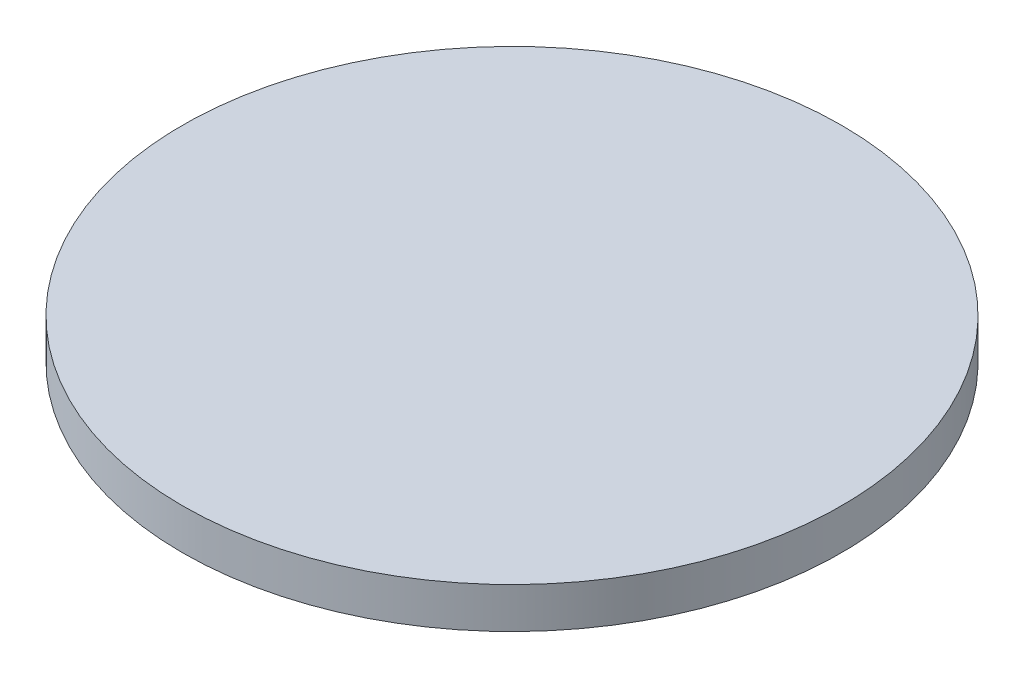
ISO-10303-21;
HEADER;
FILE_DESCRIPTION(('STEP AP214'),'2;1');
FILE_NAME('part.step','',(''),(''),'','','');
FILE_SCHEMA(('AUTOMOTIVE_DESIGN { 1 0 10303 214 1 1 1 1 }'));
ENDSEC;
DATA;
#1=APPLICATION_CONTEXT('core data for automotive mechanical design processes');
#2=APPLICATION_PROTOCOL_DEFINITION('international standard','automotive_design',2000,#1);
#3=PRODUCT_CONTEXT('',#1,'mechanical');
#4=PRODUCT('Part','Part','',(#3));
#5=PRODUCT_RELATED_PRODUCT_CATEGORY('part','',(#4));
#6=PRODUCT_DEFINITION_FORMATION('','',#4);
#7=PRODUCT_DEFINITION_CONTEXT('part definition',#1,'design');
#8=PRODUCT_DEFINITION('design','',#6,#7);
#9=PRODUCT_DEFINITION_SHAPE('','',#8);
#10=(LENGTH_UNIT() NAMED_UNIT(*) SI_UNIT(.MILLI.,.METRE.));
#11=(NAMED_UNIT(*) PLANE_ANGLE_UNIT() SI_UNIT($,.RADIAN.));
#12=(NAMED_UNIT(*) SI_UNIT($,.STERADIAN.) SOLID_ANGLE_UNIT());
#13=UNCERTAINTY_MEASURE_WITH_UNIT(LENGTH_MEASURE(1.E-05),#10,'distance_accuracy_value','');
#14=(GEOMETRIC_REPRESENTATION_CONTEXT(3) GLOBAL_UNCERTAINTY_ASSIGNED_CONTEXT((#13)) GLOBAL_UNIT_ASSIGNED_CONTEXT((#10,
#11,#12)) REPRESENTATION_CONTEXT('',''));
#15=CARTESIAN_POINT('',(0.,0.,0.));
#16=DIRECTION('',(0.,0.,1.));
#17=DIRECTION('',(1.,0.,0.));
#18=AXIS2_PLACEMENT_3D('',#15,#16,#17);
#19=CARTESIAN_POINT('',(0.,2.38125,0.));
#20=DIRECTION('',(0.,-1.,0.));
#21=DIRECTION('',(0.,0.,-1.));
#22=AXIS2_PLACEMENT_3D('',#19,#20,#21);
#23=CYLINDRICAL_SURFACE('',#22,19.2786);
#24=CARTESIAN_POINT('',(0.,2.38125,0.));
#25=DIRECTION('',(0.,1.,0.));
#26=DIRECTION('',(0.,0.,1.));
#27=AXIS2_PLACEMENT_3D('',#24,#25,#26);
#28=CIRCLE('',#27,19.2786);
#29=CARTESIAN_POINT('',(0.,2.38125,-19.2786));
#30=VERTEX_POINT('',#29);
#31=EDGE_CURVE('E10',#30,#30,#28,.T.);
#32=CARTESIAN_POINT('',(0.,0.,0.));
#33=DIRECTION('',(0.,1.,0.));
#34=DIRECTION('',(0.,0.,1.));
#35=AXIS2_PLACEMENT_3D('',#32,#33,#34);
#36=CIRCLE('',#35,19.2786);
#37=CARTESIAN_POINT('',(0.,0.,-19.2786));
#38=VERTEX_POINT('',#37);
#39=EDGE_CURVE('E34',#38,#38,#36,.T.);
#40=CARTESIAN_POINT('',(0.,2.38125,-19.2786));
#41=CARTESIAN_POINT('',(0.,2.3564453125,-19.2786));
#42=CARTESIAN_POINT('',(0.,2.331640625,-19.2786));
#43=CARTESIAN_POINT('',(0.,2.28203125,-19.2786));
#44=CARTESIAN_POINT('',(0.,2.2572265625,-19.2786));
#45=CARTESIAN_POINT('',(0.,2.2076171875,-19.2786));
#46=CARTESIAN_POINT('',(0.,2.1828125,-19.2786));
#47=CARTESIAN_POINT('',(0.,2.133203125,-19.2786));
#48=CARTESIAN_POINT('',(0.,2.1083984375,-19.2786));
#49=CARTESIAN_POINT('',(0.,2.0587890625,-19.2786));
#50=CARTESIAN_POINT('',(0.,2.033984375,-19.2786));
#51=CARTESIAN_POINT('',(0.,1.984375,-19.2786));
#52=CARTESIAN_POINT('',(0.,1.9595703125,-19.2786));
#53=CARTESIAN_POINT('',(0.,1.9099609375,-19.2786));
#54=CARTESIAN_POINT('',(0.,1.88515625,-19.2786));
#55=CARTESIAN_POINT('',(0.,1.835546875,-19.2786));
#56=CARTESIAN_POINT('',(0.,1.8107421875,-19.2786));
#57=CARTESIAN_POINT('',(0.,1.7611328125,-19.2786));
#58=CARTESIAN_POINT('',(0.,1.736328125,-19.2786));
#59=CARTESIAN_POINT('',(0.,1.68671875,-19.2786));
#60=CARTESIAN_POINT('',(0.,1.6619140625,-19.2786));
#61=CARTESIAN_POINT('',(0.,1.6123046875,-19.2786));
#62=CARTESIAN_POINT('',(0.,1.5875,-19.2786));
#63=CARTESIAN_POINT('',(0.,1.537890625,-19.2786));
#64=CARTESIAN_POINT('',(0.,1.5130859375,-19.2786));
#65=CARTESIAN_POINT('',(0.,1.4634765625,-19.2786));
#66=CARTESIAN_POINT('',(0.,1.438671875,-19.2786));
#67=CARTESIAN_POINT('',(0.,1.3890625,-19.2786));
#68=CARTESIAN_POINT('',(0.,1.3642578125,-19.2786));
#69=CARTESIAN_POINT('',(0.,1.3146484375,-19.2786));
#70=CARTESIAN_POINT('',(0.,1.28984375,-19.2786));
#71=CARTESIAN_POINT('',(0.,1.240234375,-19.2786));
#72=CARTESIAN_POINT('',(0.,1.2154296875,-19.2786));
#73=CARTESIAN_POINT('',(0.,1.1658203125,-19.2786));
#74=CARTESIAN_POINT('',(0.,1.141015625,-19.2786));
#75=CARTESIAN_POINT('',(0.,1.09140625,-19.2786));
#76=CARTESIAN_POINT('',(0.,1.0666015625,-19.2786));
#77=CARTESIAN_POINT('',(0.,1.0169921875,-19.2786));
#78=CARTESIAN_POINT('',(0.,0.9921875,-19.2786));
#79=CARTESIAN_POINT('',(0.,0.942578125,-19.2786));
#80=CARTESIAN_POINT('',(0.,0.9177734375,-19.2786));
#81=CARTESIAN_POINT('',(0.,0.8681640625,-19.2786));
#82=CARTESIAN_POINT('',(0.,0.843359375,-19.2786));
#83=CARTESIAN_POINT('',(0.,0.79375,-19.2786));
#84=CARTESIAN_POINT('',(0.,0.7689453125,-19.2786));
#85=CARTESIAN_POINT('',(0.,0.7193359375,-19.2786));
#86=CARTESIAN_POINT('',(0.,0.69453125,-19.2786));
#87=CARTESIAN_POINT('',(0.,0.644921875,-19.2786));
#88=CARTESIAN_POINT('',(0.,0.6201171875,-19.2786));
#89=CARTESIAN_POINT('',(0.,0.5705078125,-19.2786));
#90=CARTESIAN_POINT('',(0.,0.545703125,-19.2786));
#91=CARTESIAN_POINT('',(0.,0.49609375,-19.2786));
#92=CARTESIAN_POINT('',(0.,0.4712890625,-19.2786));
#93=CARTESIAN_POINT('',(0.,0.4216796875,-19.2786));
#94=CARTESIAN_POINT('',(0.,0.396875,-19.2786));
#95=CARTESIAN_POINT('',(0.,0.347265625,-19.2786));
#96=CARTESIAN_POINT('',(0.,0.3224609375,-19.2786));
#97=CARTESIAN_POINT('',(0.,0.2728515625,-19.2786));
#98=CARTESIAN_POINT('',(0.,0.248046875,-19.2786));
#99=CARTESIAN_POINT('',(0.,0.1984375,-19.2786));
#100=CARTESIAN_POINT('',(0.,0.1736328125,-19.2786));
#101=CARTESIAN_POINT('',(0.,0.1240234375,-19.2786));
#102=CARTESIAN_POINT('',(0.,0.0992187500000001,-19.2786));
#103=CARTESIAN_POINT('',(0.,0.049609375,-19.2786));
#104=CARTESIAN_POINT('',(0.,0.0248046875,-19.2786));
#105=CARTESIAN_POINT('',(0.,0.,-19.2786));
#106=B_SPLINE_CURVE_WITH_KNOTS('',3,(#40,#41,#42,#43,#44,#45,#46,#47,#48,#49,#50,#51,#52,#53,
#54,#55,#56,#57,#58,#59,#60,#61,#62,#63,#64,#65,#66,#67,#68,#69,#70,#71,#72,#73,#74,#75,#76,#77,
#78,#79,#80,#81,#82,#83,#84,#85,#86,#87,#88,#89,#90,#91,#92,#93,#94,#95,#96,#97,#98,#99,#100,
#101,#102,#103,#104,#105),.UNSPECIFIED.,.F.,.F.,(4,2,2,2,2,2,2,2,2,2,2,2,2,2,2,2,2,2,2,2,2,2,2,
2,2,2,2,2,2,2,2,2,4),(0.,0.0744140625,0.148828125,0.2232421875,0.29765625,0.3720703125,
0.446484375,0.5208984375,0.5953125,0.6697265625,0.744140625,0.8185546875,0.89296875,
0.9673828125,1.041796875,1.1162109375,1.190625,1.2650390625,1.339453125,1.4138671875,1.48828125,
1.5626953125,1.637109375,1.7115234375,1.7859375,1.8603515625,1.934765625,2.0091796875,
2.08359375,2.1580078125,2.232421875,2.3068359375,2.38125),.UNSPECIFIED.);
#107=EDGE_CURVE('BSEAM31',#30,#38,#106,.T.);
#108=ORIENTED_EDGE('',*,*,#31,.F.);
#109=ORIENTED_EDGE('',*,*,#39,.T.);
#110=ORIENTED_EDGE('',*,*,#107,.T.);
#111=ORIENTED_EDGE('',*,*,#107,.F.);
#112=EDGE_LOOP('',(#108,#110,#109,#111));
#113=FACE_BOUND('',#112,.T.);
#114=ADVANCED_FACE('F31',(#113),#23,.T.);
#115=CARTESIAN_POINT('',(0.,2.38125,0.));
#116=DIRECTION('',(0.,1.,0.));
#117=DIRECTION('',(0.,0.,1.));
#118=AXIS2_PLACEMENT_3D('',#115,#116,#117);
#119=PLANE('',#118);
#120=ORIENTED_EDGE('',*,*,#31,.T.);
#121=EDGE_LOOP('',(#120));
#122=FACE_BOUND('',#121,.T.);
#123=ADVANCED_FACE('F46',(#122),#119,.T.);
#124=CARTESIAN_POINT('',(0.,0.,0.));
#125=DIRECTION('',(0.,1.,0.));
#126=DIRECTION('',(0.,0.,1.));
#127=AXIS2_PLACEMENT_3D('',#124,#125,#126);
#128=PLANE('',#127);
#129=ORIENTED_EDGE('',*,*,#39,.F.);
#130=EDGE_LOOP('',(#129));
#131=FACE_BOUND('',#130,.T.);
#132=ADVANCED_FACE('F44',(#131),#128,.F.);
#133=CLOSED_SHELL('',(#114,#123,#132));
#134=MANIFOLD_SOLID_BREP('B2',#133);
#135=ADVANCED_BREP_SHAPE_REPRESENTATION('',(#18,#134),#14);
#136=SHAPE_DEFINITION_REPRESENTATION(#9,#135);
ENDSEC;
END-ISO-10303-21;
